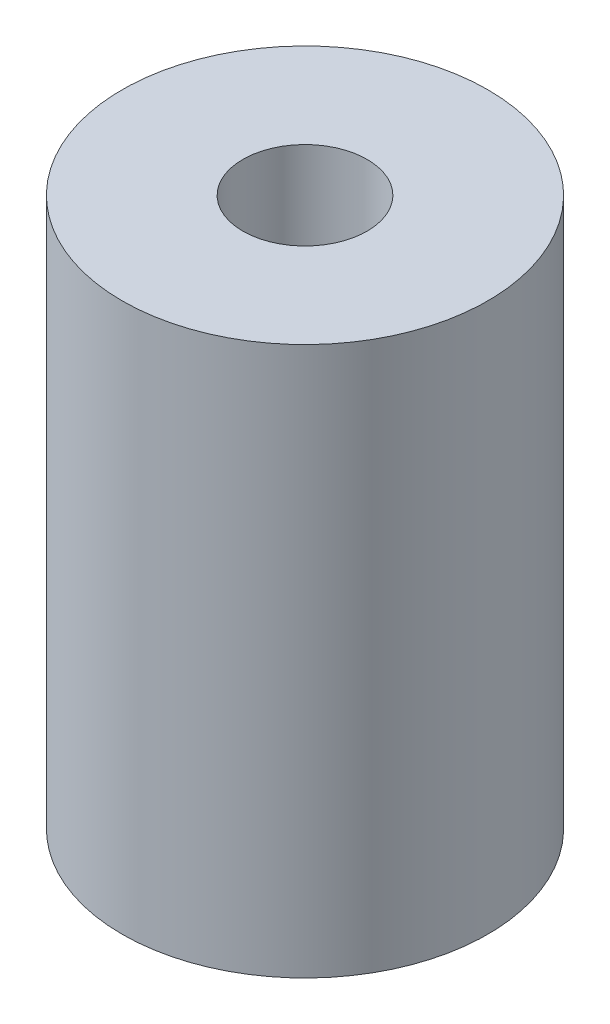
ISO-10303-21;
HEADER;
FILE_DESCRIPTION(('STEP AP214'),'2;1');
FILE_NAME('part.step','',(''),(''),'','','');
FILE_SCHEMA(('AUTOMOTIVE_DESIGN { 1 0 10303 214 1 1 1 1 }'));
ENDSEC;
DATA;
#1=APPLICATION_CONTEXT('core data for automotive mechanical design processes');
#2=APPLICATION_PROTOCOL_DEFINITION('international standard','automotive_design',2000,#1);
#3=PRODUCT_CONTEXT('',#1,'mechanical');
#4=PRODUCT('Part','Part','',(#3));
#5=PRODUCT_RELATED_PRODUCT_CATEGORY('part','',(#4));
#6=PRODUCT_DEFINITION_FORMATION('','',#4);
#7=PRODUCT_DEFINITION_CONTEXT('part definition',#1,'design');
#8=PRODUCT_DEFINITION('design','',#6,#7);
#9=PRODUCT_DEFINITION_SHAPE('','',#8);
#10=(LENGTH_UNIT() NAMED_UNIT(*) SI_UNIT(.MILLI.,.METRE.));
#11=(NAMED_UNIT(*) PLANE_ANGLE_UNIT() SI_UNIT($,.RADIAN.));
#12=(NAMED_UNIT(*) SI_UNIT($,.STERADIAN.) SOLID_ANGLE_UNIT());
#13=UNCERTAINTY_MEASURE_WITH_UNIT(LENGTH_MEASURE(1.E-05),#10,'distance_accuracy_value','');
#14=(GEOMETRIC_REPRESENTATION_CONTEXT(3) GLOBAL_UNCERTAINTY_ASSIGNED_CONTEXT((#13)) GLOBAL_UNIT_ASSIGNED_CONTEXT((#10,
#11,#12)) REPRESENTATION_CONTEXT('',''));
#15=CARTESIAN_POINT('',(0.,0.,0.));
#16=DIRECTION('',(0.,0.,1.));
#17=DIRECTION('',(1.,0.,0.));
#18=AXIS2_PLACEMENT_3D('',#15,#16,#17);
#19=CARTESIAN_POINT('',(0.,15.,0.));
#20=DIRECTION('',(0.,1.,0.));
#21=DIRECTION('',(0.,0.,1.));
#22=AXIS2_PLACEMENT_3D('',#19,#20,#21);
#23=PLANE('',#22);
#24=CARTESIAN_POINT('',(0.,15.,0.));
#25=DIRECTION('',(0.,1.,0.));
#26=DIRECTION('',(0.,0.,1.));
#27=AXIS2_PLACEMENT_3D('',#24,#25,#26);
#28=CIRCLE('',#27,5.);
#29=CARTESIAN_POINT('',(0.,15.,5.));
#30=VERTEX_POINT('',#29);
#31=EDGE_CURVE('E10',#30,#30,#28,.T.);
#32=ORIENTED_EDGE('',*,*,#31,.T.);
#33=EDGE_LOOP('',(#32));
#34=FACE_BOUND('',#33,.T.);
#35=CARTESIAN_POINT('',(0.,15.,0.));
#36=DIRECTION('',(0.,1.,0.));
#37=DIRECTION('',(0.,0.,1.));
#38=AXIS2_PLACEMENT_3D('',#35,#36,#37);
#39=CIRCLE('',#38,1.7);
#40=CARTESIAN_POINT('',(0.,15.,1.7));
#41=VERTEX_POINT('',#40);
#42=EDGE_CURVE('E61',#41,#41,#39,.T.);
#43=ORIENTED_EDGE('',*,*,#42,.F.);
#44=EDGE_LOOP('',(#43));
#45=FACE_BOUND('',#44,.T.);
#46=ADVANCED_FACE('F47',(#34,#45),#23,.T.);
#47=CARTESIAN_POINT('',(0.,0.,0.));
#48=DIRECTION('',(0.,1.,0.));
#49=DIRECTION('',(0.,0.,1.));
#50=AXIS2_PLACEMENT_3D('',#47,#48,#49);
#51=PLANE('',#50);
#52=CARTESIAN_POINT('',(0.,0.,0.));
#53=DIRECTION('',(0.,1.,0.));
#54=DIRECTION('',(0.,0.,1.));
#55=AXIS2_PLACEMENT_3D('',#52,#53,#54);
#56=CIRCLE('',#55,5.);
#57=CARTESIAN_POINT('',(0.,0.,5.));
#58=VERTEX_POINT('',#57);
#59=EDGE_CURVE('E51',#58,#58,#56,.T.);
#60=ORIENTED_EDGE('',*,*,#59,.F.);
#61=EDGE_LOOP('',(#60));
#62=FACE_BOUND('',#61,.T.);
#63=CARTESIAN_POINT('',(0.,0.,0.));
#64=DIRECTION('',(0.,1.,0.));
#65=DIRECTION('',(0.,0.,1.));
#66=AXIS2_PLACEMENT_3D('',#63,#64,#65);
#67=CIRCLE('',#66,1.7);
#68=CARTESIAN_POINT('',(0.,0.,1.7));
#69=VERTEX_POINT('',#68);
#70=EDGE_CURVE('E63',#69,#69,#67,.T.);
#71=ORIENTED_EDGE('',*,*,#70,.T.);
#72=EDGE_LOOP('',(#71));
#73=FACE_BOUND('',#72,.T.);
#74=ADVANCED_FACE('F76',(#62,#73),#51,.F.);
#75=CARTESIAN_POINT('',(0.,15.,0.));
#76=DIRECTION('',(0.,-1.,0.));
#77=DIRECTION('',(0.,0.,-1.));
#78=AXIS2_PLACEMENT_3D('',#75,#76,#77);
#79=CYLINDRICAL_SURFACE('',#78,5.);
#80=ORIENTED_EDGE('',*,*,#31,.F.);
#81=EDGE_LOOP('',(#80));
#82=FACE_BOUND('',#81,.T.);
#83=ORIENTED_EDGE('',*,*,#59,.T.);
#84=EDGE_LOOP('',(#83));
#85=FACE_BOUND('',#84,.T.);
#86=ADVANCED_FACE('F49',(#82,#85),#79,.T.);
#87=CARTESIAN_POINT('',(0.,15.,0.));
#88=DIRECTION('',(0.,-1.,0.));
#89=DIRECTION('',(0.,0.,-1.));
#90=AXIS2_PLACEMENT_3D('',#87,#88,#89);
#91=CYLINDRICAL_SURFACE('',#90,1.7);
#92=ORIENTED_EDGE('',*,*,#42,.T.);
#93=EDGE_LOOP('',(#92));
#94=FACE_BOUND('',#93,.T.);
#95=ORIENTED_EDGE('',*,*,#70,.F.);
#96=EDGE_LOOP('',(#95));
#97=FACE_BOUND('',#96,.T.);
#98=ADVANCED_FACE('F72',(#94,#97),#91,.F.);
#99=CLOSED_SHELL('',(#46,#74,#86,#98));
#100=MANIFOLD_SOLID_BREP('B2',#99);
#101=ADVANCED_BREP_SHAPE_REPRESENTATION('',(#18,#100),#14);
#102=SHAPE_DEFINITION_REPRESENTATION(#9,#101);
ENDSEC;
END-ISO-10303-21;
